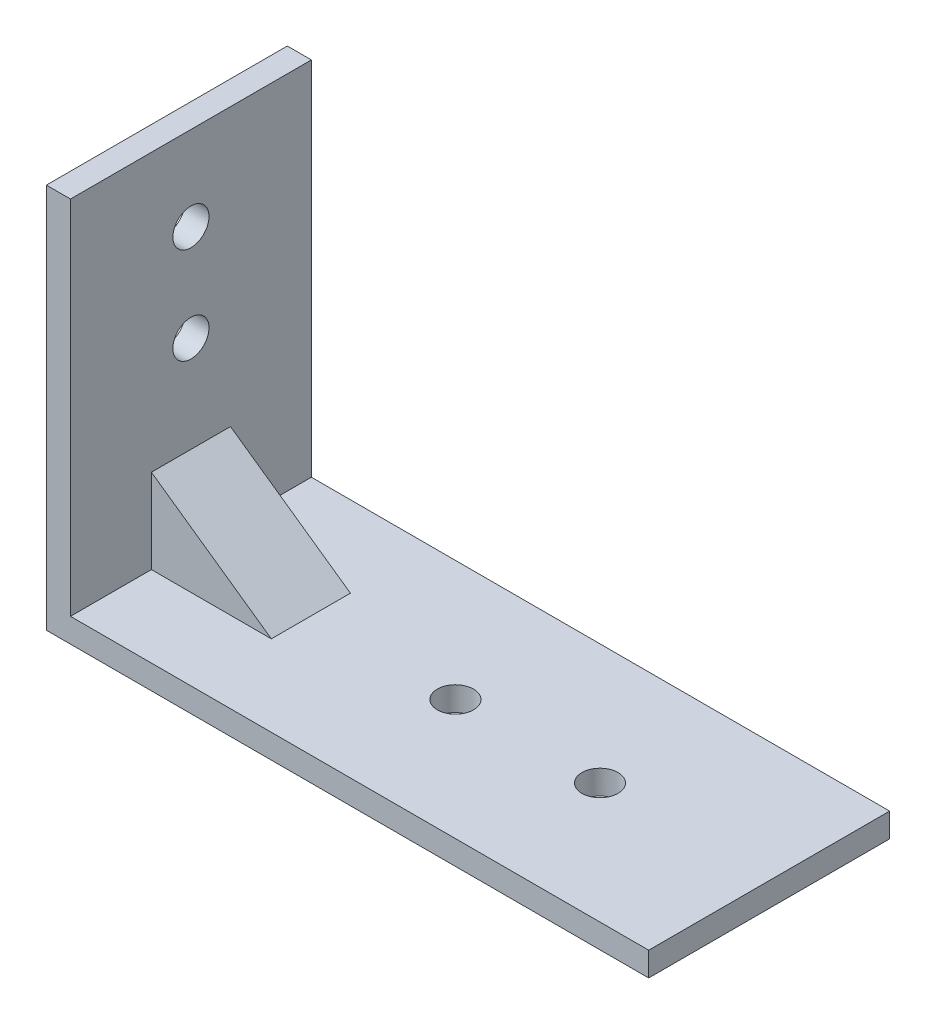
ISO-10303-21;
HEADER;
FILE_DESCRIPTION(('STEP AP214'),'2;1');
FILE_NAME('part.step','',(''),(''),'','','');
FILE_SCHEMA(('AUTOMOTIVE_DESIGN { 1 0 10303 214 1 1 1 1 }'));
ENDSEC;
DATA;
#1=APPLICATION_CONTEXT('core data for automotive mechanical design processes');
#2=APPLICATION_PROTOCOL_DEFINITION('international standard','automotive_design',2000,#1);
#3=PRODUCT_CONTEXT('',#1,'mechanical');
#4=PRODUCT('Part','Part','',(#3));
#5=PRODUCT_RELATED_PRODUCT_CATEGORY('part','',(#4));
#6=PRODUCT_DEFINITION_FORMATION('','',#4);
#7=PRODUCT_DEFINITION_CONTEXT('part definition',#1,'design');
#8=PRODUCT_DEFINITION('design','',#6,#7);
#9=PRODUCT_DEFINITION_SHAPE('','',#8);
#10=(LENGTH_UNIT() NAMED_UNIT(*) SI_UNIT(.MILLI.,.METRE.));
#11=(NAMED_UNIT(*) PLANE_ANGLE_UNIT() SI_UNIT($,.RADIAN.));
#12=(NAMED_UNIT(*) SI_UNIT($,.STERADIAN.) SOLID_ANGLE_UNIT());
#13=UNCERTAINTY_MEASURE_WITH_UNIT(LENGTH_MEASURE(1.E-05),#10,'distance_accuracy_value','');
#14=(GEOMETRIC_REPRESENTATION_CONTEXT(3) GLOBAL_UNCERTAINTY_ASSIGNED_CONTEXT((#13)) GLOBAL_UNIT_ASSIGNED_CONTEXT((#10,
#11,#12)) REPRESENTATION_CONTEXT('',''));
#15=CARTESIAN_POINT('',(0.,0.,0.));
#16=DIRECTION('',(0.,0.,1.));
#17=DIRECTION('',(1.,0.,0.));
#18=AXIS2_PLACEMENT_3D('',#15,#16,#17);
#19=CARTESIAN_POINT('',(0.,2.,0.));
#20=DIRECTION('',(0.,-1.,0.));
#21=DIRECTION('',(0.,0.,-1.));
#22=AXIS2_PLACEMENT_3D('',#19,#20,#21);
#23=PLANE('',#22);
#24=CARTESIAN_POINT('',(23.9553851130105,2.,-10.));
#25=DIRECTION('',(0.,1.,0.));
#26=DIRECTION('',(0.,0.,1.));
#27=AXIS2_PLACEMENT_3D('',#24,#25,#26);
#28=CIRCLE('',#27,1.5);
#29=CARTESIAN_POINT('',(23.9553851130105,2.,-8.5));
#30=VERTEX_POINT('',#29);
#31=EDGE_CURVE('E209',#30,#30,#28,.T.);
#32=ORIENTED_EDGE('',*,*,#31,.F.);
#33=EDGE_LOOP('',(#32));
#34=FACE_BOUND('',#33,.T.);
#35=CARTESIAN_POINT('',(35.9553851130105,2.,-10.));
#36=DIRECTION('',(0.,1.,0.));
#37=DIRECTION('',(0.,0.,1.));
#38=AXIS2_PLACEMENT_3D('',#35,#36,#37);
#39=CIRCLE('',#38,1.5);
#40=CARTESIAN_POINT('',(35.9553851130105,2.,-8.49999999999999));
#41=VERTEX_POINT('',#40);
#42=EDGE_CURVE('E221',#41,#41,#39,.T.);
#43=ORIENTED_EDGE('',*,*,#42,.F.);
#44=EDGE_LOOP('',(#43));
#45=FACE_BOUND('',#44,.T.);
#46=DIRECTION('',(1.,0.,0.));
#47=VECTOR('',#46,1.);
#48=CARTESIAN_POINT('',(2.,2.,-6.72));
#49=LINE('',#48,#47);
#50=CARTESIAN_POINT('',(2.,2.,-6.72));
#51=VERTEX_POINT('',#50);
#52=CARTESIAN_POINT('',(11.9553851130105,2.,-6.72));
#53=VERTEX_POINT('',#52);
#54=EDGE_CURVE('E133',#51,#53,#49,.T.);
#55=ORIENTED_EDGE('',*,*,#54,.F.);
#56=DIRECTION('',(0.,0.,-1.));
#57=VECTOR('',#56,1.);
#58=CARTESIAN_POINT('',(2.,2.,-20.));
#59=LINE('',#58,#57);
#60=CARTESIAN_POINT('',(2.,2.,0.));
#61=VERTEX_POINT('',#60);
#62=EDGE_CURVE('E71',#61,#51,#59,.T.);
#63=ORIENTED_EDGE('',*,*,#62,.F.);
#64=DIRECTION('',(1.,0.,0.));
#65=VECTOR('',#64,1.);
#66=CARTESIAN_POINT('',(0.,2.,0.));
#67=LINE('',#66,#65);
#68=CARTESIAN_POINT('',(50.,2.,0.));
#69=VERTEX_POINT('',#68);
#70=EDGE_CURVE('E172',#61,#69,#67,.T.);
#71=ORIENTED_EDGE('',*,*,#70,.T.);
#72=DIRECTION('',(0.,0.,-1.));
#73=VECTOR('',#72,1.);
#74=CARTESIAN_POINT('',(50.,2.,0.));
#75=LINE('',#74,#73);
#76=CARTESIAN_POINT('',(50.,2.,-20.));
#77=VERTEX_POINT('',#76);
#78=EDGE_CURVE('E175',#69,#77,#75,.T.);
#79=ORIENTED_EDGE('',*,*,#78,.T.);
#80=DIRECTION('',(-1.,0.,0.));
#81=VECTOR('',#80,1.);
#82=CARTESIAN_POINT('',(0.,2.,-20.));
#83=LINE('',#82,#81);
#84=CARTESIAN_POINT('',(2.,2.,-20.));
#85=VERTEX_POINT('',#84);
#86=EDGE_CURVE('E179',#77,#85,#83,.T.);
#87=ORIENTED_EDGE('',*,*,#86,.T.);
#88=CARTESIAN_POINT('',(2.,2.,-13.2847852704556));
#89=VERTEX_POINT('',#88);
#90=EDGE_CURVE('E141',#89,#85,#59,.T.);
#91=ORIENTED_EDGE('',*,*,#90,.F.);
#92=DIRECTION('',(-1.,0.,0.));
#93=VECTOR('',#92,1.);
#94=CARTESIAN_POINT('',(2.,2.,-13.2847852704556));
#95=LINE('',#94,#93);
#96=CARTESIAN_POINT('',(11.9553851130105,2.,-13.2847852704556));
#97=VERTEX_POINT('',#96);
#98=EDGE_CURVE('E128',#97,#89,#95,.T.);
#99=ORIENTED_EDGE('',*,*,#98,.F.);
#100=DIRECTION('',(0.,0.,-1.));
#101=VECTOR('',#100,1.);
#102=CARTESIAN_POINT('',(11.9553851130105,2.,-13.2847852704556));
#103=LINE('',#102,#101);
#104=EDGE_CURVE('E241',#53,#97,#103,.T.);
#105=ORIENTED_EDGE('',*,*,#104,.F.);
#106=EDGE_LOOP('',(#55,#63,#71,#79,#87,#91,#99,#105));
#107=FACE_BOUND('',#106,.T.);
#108=ADVANCED_FACE('F45',(#34,#45,#107),#23,.F.);
#109=CARTESIAN_POINT('',(2.,32.,-20.));
#110=DIRECTION('',(-1.,0.,0.));
#111=DIRECTION('',(0.,0.,1.));
#112=AXIS2_PLACEMENT_3D('',#109,#110,#111);
#113=PLANE('',#112);
#114=CARTESIAN_POINT('',(2.,17.,-10.001560414279));
#115=DIRECTION('',(1.,0.,0.));
#116=DIRECTION('',(0.,0.,-1.));
#117=AXIS2_PLACEMENT_3D('',#114,#115,#116);
#118=CIRCLE('',#117,1.5);
#119=CARTESIAN_POINT('',(2.,17.,-11.501560414279));
#120=VERTEX_POINT('',#119);
#121=EDGE_CURVE('E215',#120,#120,#118,.T.);
#122=ORIENTED_EDGE('',*,*,#121,.F.);
#123=EDGE_LOOP('',(#122));
#124=FACE_BOUND('',#123,.T.);
#125=CARTESIAN_POINT('',(2.,24.999999956713,-10.0007281933347));
#126=DIRECTION('',(1.,0.,0.));
#127=DIRECTION('',(0.,0.,-1.));
#128=AXIS2_PLACEMENT_3D('',#125,#126,#127);
#129=CIRCLE('',#128,1.5);
#130=CARTESIAN_POINT('',(2.,24.999999956713,-11.5007281933347));
#131=VERTEX_POINT('',#130);
#132=EDGE_CURVE('E223',#131,#131,#129,.T.);
#133=ORIENTED_EDGE('',*,*,#132,.F.);
#134=EDGE_LOOP('',(#133));
#135=FACE_BOUND('',#134,.T.);
#136=DIRECTION('',(0.,0.,1.));
#137=VECTOR('',#136,1.);
#138=CARTESIAN_POINT('',(2.,9.,-13.2847852704556));
#139=LINE('',#138,#137);
#140=CARTESIAN_POINT('',(2.,9.,-13.2847852704556));
#141=VERTEX_POINT('',#140);
#142=CARTESIAN_POINT('',(2.,9.,-6.72));
#143=VERTEX_POINT('',#142);
#144=EDGE_CURVE('E118',#141,#143,#139,.T.);
#145=ORIENTED_EDGE('',*,*,#144,.F.);
#146=DIRECTION('',(0.,-1.,0.));
#147=VECTOR('',#146,1.);
#148=CARTESIAN_POINT('',(2.,9.,-13.2847852704556));
#149=LINE('',#148,#147);
#150=EDGE_CURVE('E127',#141,#89,#149,.T.);
#151=ORIENTED_EDGE('',*,*,#150,.T.);
#152=ORIENTED_EDGE('',*,*,#90,.T.);
#153=DIRECTION('',(0.,-1.,0.));
#154=VECTOR('',#153,1.);
#155=CARTESIAN_POINT('',(2.,32.,-20.));
#156=LINE('',#155,#154);
#157=CARTESIAN_POINT('',(2.,32.,-20.));
#158=VERTEX_POINT('',#157);
#159=EDGE_CURVE('E162',#158,#85,#156,.T.);
#160=ORIENTED_EDGE('',*,*,#159,.F.);
#161=DIRECTION('',(0.,0.,-1.));
#162=VECTOR('',#161,1.);
#163=CARTESIAN_POINT('',(2.,32.,-20.));
#164=LINE('',#163,#162);
#165=CARTESIAN_POINT('',(2.,32.,0.));
#166=VERTEX_POINT('',#165);
#167=EDGE_CURVE('E156',#166,#158,#164,.T.);
#168=ORIENTED_EDGE('',*,*,#167,.F.);
#169=DIRECTION('',(0.,-1.,0.));
#170=VECTOR('',#169,1.);
#171=CARTESIAN_POINT('',(2.,32.,0.));
#172=LINE('',#171,#170);
#173=EDGE_CURVE('E168',#166,#61,#172,.T.);
#174=ORIENTED_EDGE('',*,*,#173,.T.);
#175=ORIENTED_EDGE('',*,*,#62,.T.);
#176=DIRECTION('',(0.,-1.,0.));
#177=VECTOR('',#176,1.);
#178=CARTESIAN_POINT('',(2.,9.,-6.72));
#179=LINE('',#178,#177);
#180=EDGE_CURVE('E132',#143,#51,#179,.T.);
#181=ORIENTED_EDGE('',*,*,#180,.F.);
#182=EDGE_LOOP('',(#145,#151,#152,#160,#168,#174,#175,#181));
#183=FACE_BOUND('',#182,.T.);
#184=ADVANCED_FACE('F138',(#124,#135,#183),#113,.F.);
#185=CARTESIAN_POINT('',(0.,2.,0.));
#186=DIRECTION('',(1.,0.,0.));
#187=DIRECTION('',(0.,0.,-1.));
#188=AXIS2_PLACEMENT_3D('',#185,#186,#187);
#189=PLANE('',#188);
#190=CARTESIAN_POINT('',(0.,17.,-10.001560414279));
#191=DIRECTION('',(1.,0.,0.));
#192=DIRECTION('',(0.,0.,-1.));
#193=AXIS2_PLACEMENT_3D('',#190,#191,#192);
#194=CIRCLE('',#193,1.5);
#195=CARTESIAN_POINT('',(0.,17.,-11.501560414279));
#196=VERTEX_POINT('',#195);
#197=EDGE_CURVE('E49',#196,#196,#194,.T.);
#198=ORIENTED_EDGE('',*,*,#197,.T.);
#199=EDGE_LOOP('',(#198));
#200=FACE_BOUND('',#199,.T.);
#201=CARTESIAN_POINT('',(0.,24.999999956713,-10.0007281933347));
#202=DIRECTION('',(1.,0.,0.));
#203=DIRECTION('',(0.,0.,-1.));
#204=AXIS2_PLACEMENT_3D('',#201,#202,#203);
#205=CIRCLE('',#204,1.5);
#206=CARTESIAN_POINT('',(0.,24.999999956713,-11.5007281933347));
#207=VERTEX_POINT('',#206);
#208=EDGE_CURVE('E212',#207,#207,#205,.T.);
#209=ORIENTED_EDGE('',*,*,#208,.T.);
#210=EDGE_LOOP('',(#209));
#211=FACE_BOUND('',#210,.T.);
#212=DIRECTION('',(0.,0.,1.));
#213=VECTOR('',#212,1.);
#214=CARTESIAN_POINT('',(0.,0.,0.));
#215=LINE('',#214,#213);
#216=CARTESIAN_POINT('',(0.,0.,-20.));
#217=VERTEX_POINT('',#216);
#218=CARTESIAN_POINT('',(0.,0.,0.));
#219=VERTEX_POINT('',#218);
#220=EDGE_CURVE('E171',#217,#219,#215,.T.);
#221=ORIENTED_EDGE('',*,*,#220,.T.);
#222=DIRECTION('',(0.,-1.,0.));
#223=VECTOR('',#222,1.);
#224=CARTESIAN_POINT('',(0.,2.,0.));
#225=LINE('',#224,#223);
#226=CARTESIAN_POINT('',(0.,32.,0.));
#227=VERTEX_POINT('',#226);
#228=EDGE_CURVE('E11',#227,#219,#225,.T.);
#229=ORIENTED_EDGE('',*,*,#228,.F.);
#230=DIRECTION('',(0.,0.,1.));
#231=VECTOR('',#230,1.);
#232=CARTESIAN_POINT('',(0.,32.,-20.));
#233=LINE('',#232,#231);
#234=CARTESIAN_POINT('',(0.,32.,-20.));
#235=VERTEX_POINT('',#234);
#236=EDGE_CURVE('E149',#235,#227,#233,.T.);
#237=ORIENTED_EDGE('',*,*,#236,.F.);
#238=DIRECTION('',(0.,-1.,0.));
#239=VECTOR('',#238,1.);
#240=CARTESIAN_POINT('',(0.,2.,-20.));
#241=LINE('',#240,#239);
#242=EDGE_CURVE('E183',#235,#217,#241,.T.);
#243=ORIENTED_EDGE('',*,*,#242,.T.);
#244=EDGE_LOOP('',(#221,#229,#237,#243));
#245=FACE_BOUND('',#244,.T.);
#246=ADVANCED_FACE('F47',(#200,#211,#245),#189,.F.);
#247=CARTESIAN_POINT('',(0.,2.,0.));
#248=DIRECTION('',(0.,0.,-1.));
#249=DIRECTION('',(-1.,0.,0.));
#250=AXIS2_PLACEMENT_3D('',#247,#248,#249);
#251=PLANE('',#250);
#252=DIRECTION('',(1.,0.,0.));
#253=VECTOR('',#252,1.);
#254=CARTESIAN_POINT('',(0.,0.,0.));
#255=LINE('',#254,#253);
#256=CARTESIAN_POINT('',(50.,0.,0.));
#257=VERTEX_POINT('',#256);
#258=EDGE_CURVE('E187',#219,#257,#255,.T.);
#259=ORIENTED_EDGE('',*,*,#258,.T.);
#260=DIRECTION('',(0.,-1.,0.));
#261=VECTOR('',#260,1.);
#262=CARTESIAN_POINT('',(50.,2.,0.));
#263=LINE('',#262,#261);
#264=EDGE_CURVE('E55',#69,#257,#263,.T.);
#265=ORIENTED_EDGE('',*,*,#264,.F.);
#266=ORIENTED_EDGE('',*,*,#70,.F.);
#267=ORIENTED_EDGE('',*,*,#173,.F.);
#268=DIRECTION('',(1.,0.,0.));
#269=VECTOR('',#268,1.);
#270=CARTESIAN_POINT('',(0.,32.,0.));
#271=LINE('',#270,#269);
#272=EDGE_CURVE('E153',#227,#166,#271,.T.);
#273=ORIENTED_EDGE('',*,*,#272,.F.);
#274=ORIENTED_EDGE('',*,*,#228,.T.);
#275=EDGE_LOOP('',(#259,#265,#266,#267,#273,#274));
#276=FACE_BOUND('',#275,.T.);
#277=ADVANCED_FACE('F262',(#276),#251,.F.);
#278=CARTESIAN_POINT('',(50.,2.,0.));
#279=DIRECTION('',(-1.,0.,0.));
#280=DIRECTION('',(0.,0.,1.));
#281=AXIS2_PLACEMENT_3D('',#278,#279,#280);
#282=PLANE('',#281);
#283=DIRECTION('',(0.,0.,-1.));
#284=VECTOR('',#283,1.);
#285=CARTESIAN_POINT('',(50.,0.,0.));
#286=LINE('',#285,#284);
#287=CARTESIAN_POINT('',(50.,0.,-20.));
#288=VERTEX_POINT('',#287);
#289=EDGE_CURVE('E190',#257,#288,#286,.T.);
#290=ORIENTED_EDGE('',*,*,#289,.T.);
#291=DIRECTION('',(0.,-1.,0.));
#292=VECTOR('',#291,1.);
#293=CARTESIAN_POINT('',(50.,2.,-20.));
#294=LINE('',#293,#292);
#295=EDGE_CURVE('E198',#77,#288,#294,.T.);
#296=ORIENTED_EDGE('',*,*,#295,.F.);
#297=ORIENTED_EDGE('',*,*,#78,.F.);
#298=ORIENTED_EDGE('',*,*,#264,.T.);
#299=EDGE_LOOP('',(#290,#296,#297,#298));
#300=FACE_BOUND('',#299,.T.);
#301=ADVANCED_FACE('F266',(#300),#282,.F.);
#302=CARTESIAN_POINT('',(0.,2.,-20.));
#303=DIRECTION('',(0.,0.,1.));
#304=DIRECTION('',(1.,0.,0.));
#305=AXIS2_PLACEMENT_3D('',#302,#303,#304);
#306=PLANE('',#305);
#307=DIRECTION('',(-1.,0.,0.));
#308=VECTOR('',#307,1.);
#309=CARTESIAN_POINT('',(0.,0.,-20.));
#310=LINE('',#309,#308);
#311=EDGE_CURVE('E176',#288,#217,#310,.T.);
#312=ORIENTED_EDGE('',*,*,#311,.T.);
#313=ORIENTED_EDGE('',*,*,#242,.F.);
#314=DIRECTION('',(-1.,0.,0.));
#315=VECTOR('',#314,1.);
#316=CARTESIAN_POINT('',(0.,32.,-20.));
#317=LINE('',#316,#315);
#318=EDGE_CURVE('E159',#158,#235,#317,.T.);
#319=ORIENTED_EDGE('',*,*,#318,.F.);
#320=ORIENTED_EDGE('',*,*,#159,.T.);
#321=ORIENTED_EDGE('',*,*,#86,.F.);
#322=ORIENTED_EDGE('',*,*,#295,.T.);
#323=EDGE_LOOP('',(#312,#313,#319,#320,#321,#322));
#324=FACE_BOUND('',#323,.T.);
#325=ADVANCED_FACE('F254',(#324),#306,.F.);
#326=CARTESIAN_POINT('',(0.,0.,0.));
#327=DIRECTION('',(0.,-1.,0.));
#328=DIRECTION('',(0.,0.,-1.));
#329=AXIS2_PLACEMENT_3D('',#326,#327,#328);
#330=PLANE('',#329);
#331=CARTESIAN_POINT('',(23.9553851130105,0.,-10.));
#332=DIRECTION('',(0.,-1.,0.));
#333=DIRECTION('',(0.,0.,-1.));
#334=AXIS2_PLACEMENT_3D('',#331,#332,#333);
#335=CIRCLE('',#334,1.5);
#336=CARTESIAN_POINT('',(23.9553851130105,0.,-11.5));
#337=VERTEX_POINT('',#336);
#338=EDGE_CURVE('E136',#337,#337,#335,.T.);
#339=ORIENTED_EDGE('',*,*,#338,.F.);
#340=EDGE_LOOP('',(#339));
#341=FACE_BOUND('',#340,.T.);
#342=CARTESIAN_POINT('',(35.9553851130105,0.,-10.));
#343=DIRECTION('',(0.,-1.,0.));
#344=DIRECTION('',(0.,0.,-1.));
#345=AXIS2_PLACEMENT_3D('',#342,#343,#344);
#346=CIRCLE('',#345,1.5);
#347=CARTESIAN_POINT('',(35.9553851130105,0.,-11.5));
#348=VERTEX_POINT('',#347);
#349=EDGE_CURVE('E205',#348,#348,#346,.T.);
#350=ORIENTED_EDGE('',*,*,#349,.F.);
#351=EDGE_LOOP('',(#350));
#352=FACE_BOUND('',#351,.T.);
#353=ORIENTED_EDGE('',*,*,#220,.F.);
#354=ORIENTED_EDGE('',*,*,#311,.F.);
#355=ORIENTED_EDGE('',*,*,#289,.F.);
#356=ORIENTED_EDGE('',*,*,#258,.F.);
#357=EDGE_LOOP('',(#353,#354,#355,#356));
#358=FACE_BOUND('',#357,.T.);
#359=ADVANCED_FACE('F270',(#341,#352,#358),#330,.T.);
#360=CARTESIAN_POINT('',(0.,32.,0.));
#361=DIRECTION('',(0.,1.,0.));
#362=DIRECTION('',(0.,0.,1.));
#363=AXIS2_PLACEMENT_3D('',#360,#361,#362);
#364=PLANE('',#363);
#365=ORIENTED_EDGE('',*,*,#236,.T.);
#366=ORIENTED_EDGE('',*,*,#272,.T.);
#367=ORIENTED_EDGE('',*,*,#167,.T.);
#368=ORIENTED_EDGE('',*,*,#318,.T.);
#369=EDGE_LOOP('',(#365,#366,#367,#368));
#370=FACE_BOUND('',#369,.T.);
#371=ADVANCED_FACE('F258',(#370),#364,.T.);
#372=CARTESIAN_POINT('',(2.,9.,-6.72));
#373=DIRECTION('',(0.,0.,-1.));
#374=DIRECTION('',(-1.,0.,0.));
#375=AXIS2_PLACEMENT_3D('',#372,#373,#374);
#376=PLANE('',#375);
#377=ORIENTED_EDGE('',*,*,#54,.T.);
#378=DIRECTION('',(0.818024525075637,-0.575183341531011,0.));
#379=VECTOR('',#378,1.);
#380=CARTESIAN_POINT('',(2.,9.,-6.72));
#381=LINE('',#380,#379);
#382=EDGE_CURVE('E121',#143,#53,#381,.T.);
#383=ORIENTED_EDGE('',*,*,#382,.F.);
#384=ORIENTED_EDGE('',*,*,#180,.T.);
#385=EDGE_LOOP('',(#377,#383,#384));
#386=FACE_BOUND('',#385,.T.);
#387=ADVANCED_FACE('F131',(#386),#376,.F.);
#388=CARTESIAN_POINT('',(2.,9.,-13.2847852704556));
#389=DIRECTION('',(0.,0.,1.));
#390=DIRECTION('',(1.,0.,0.));
#391=AXIS2_PLACEMENT_3D('',#388,#389,#390);
#392=PLANE('',#391);
#393=ORIENTED_EDGE('',*,*,#150,.F.);
#394=DIRECTION('',(0.818024525075637,-0.575183341531011,0.));
#395=VECTOR('',#394,1.);
#396=CARTESIAN_POINT('',(2.,9.,-13.2847852704556));
#397=LINE('',#396,#395);
#398=EDGE_CURVE('E63',#141,#97,#397,.T.);
#399=ORIENTED_EDGE('',*,*,#398,.T.);
#400=ORIENTED_EDGE('',*,*,#98,.T.);
#401=EDGE_LOOP('',(#393,#399,#400));
#402=FACE_BOUND('',#401,.T.);
#403=ADVANCED_FACE('F246',(#402),#392,.F.);
#404=CARTESIAN_POINT('',(2.,9.,-13.72));
#405=DIRECTION('',(-0.575183341531011,-0.818024525075636,0.));
#406=DIRECTION('',(0.818024525075637,-0.575183341531011,0.));
#407=AXIS2_PLACEMENT_3D('',#404,#405,#406);
#408=PLANE('',#407);
#409=ORIENTED_EDGE('',*,*,#144,.T.);
#410=ORIENTED_EDGE('',*,*,#382,.T.);
#411=ORIENTED_EDGE('',*,*,#104,.T.);
#412=ORIENTED_EDGE('',*,*,#398,.F.);
#413=EDGE_LOOP('',(#409,#410,#411,#412));
#414=FACE_BOUND('',#413,.T.);
#415=ADVANCED_FACE('F120',(#414),#408,.F.);
#416=CARTESIAN_POINT('',(35.9553851130105,-5.,-10.));
#417=DIRECTION('',(0.,1.,0.));
#418=DIRECTION('',(0.,0.,1.));
#419=AXIS2_PLACEMENT_3D('',#416,#417,#418);
#420=CYLINDRICAL_SURFACE('',#419,1.5);
#421=ORIENTED_EDGE('',*,*,#349,.T.);
#422=EDGE_LOOP('',(#421));
#423=FACE_BOUND('',#422,.T.);
#424=ORIENTED_EDGE('',*,*,#42,.T.);
#425=EDGE_LOOP('',(#424));
#426=FACE_BOUND('',#425,.T.);
#427=ADVANCED_FACE('F335',(#423,#426),#420,.F.);
#428=CARTESIAN_POINT('',(23.9553851130105,-5.,-10.));
#429=DIRECTION('',(0.,1.,0.));
#430=DIRECTION('',(0.,0.,1.));
#431=AXIS2_PLACEMENT_3D('',#428,#429,#430);
#432=CYLINDRICAL_SURFACE('',#431,1.5);
#433=ORIENTED_EDGE('',*,*,#338,.T.);
#434=EDGE_LOOP('',(#433));
#435=FACE_BOUND('',#434,.T.);
#436=ORIENTED_EDGE('',*,*,#31,.T.);
#437=EDGE_LOOP('',(#436));
#438=FACE_BOUND('',#437,.T.);
#439=ADVANCED_FACE('F347',(#435,#438),#432,.F.);
#440=CARTESIAN_POINT('',(-5.,24.999999956713,-10.0007281933347));
#441=DIRECTION('',(1.,0.,0.));
#442=DIRECTION('',(0.,0.,-1.));
#443=AXIS2_PLACEMENT_3D('',#440,#441,#442);
#444=CYLINDRICAL_SURFACE('',#443,1.5);
#445=ORIENTED_EDGE('',*,*,#132,.T.);
#446=EDGE_LOOP('',(#445));
#447=FACE_BOUND('',#446,.T.);
#448=ORIENTED_EDGE('',*,*,#208,.F.);
#449=EDGE_LOOP('',(#448));
#450=FACE_BOUND('',#449,.T.);
#451=ADVANCED_FACE('F357',(#447,#450),#444,.F.);
#452=CARTESIAN_POINT('',(-5.,17.,-10.001560414279));
#453=DIRECTION('',(1.,0.,0.));
#454=DIRECTION('',(0.,0.,-1.));
#455=AXIS2_PLACEMENT_3D('',#452,#453,#454);
#456=CYLINDRICAL_SURFACE('',#455,1.5);
#457=ORIENTED_EDGE('',*,*,#121,.T.);
#458=EDGE_LOOP('',(#457));
#459=FACE_BOUND('',#458,.T.);
#460=ORIENTED_EDGE('',*,*,#197,.F.);
#461=EDGE_LOOP('',(#460));
#462=FACE_BOUND('',#461,.T.);
#463=ADVANCED_FACE('F366',(#459,#462),#456,.F.);
#464=CLOSED_SHELL('',(#108,#184,#246,#277,#301,#325,#359,#371,#387,#403,#415,#427,#439,#451,#463));
#465=MANIFOLD_SOLID_BREP('B2',#464);
#466=ADVANCED_BREP_SHAPE_REPRESENTATION('',(#18,#465),#14);
#467=SHAPE_DEFINITION_REPRESENTATION(#9,#466);
ENDSEC;
END-ISO-10303-21;
